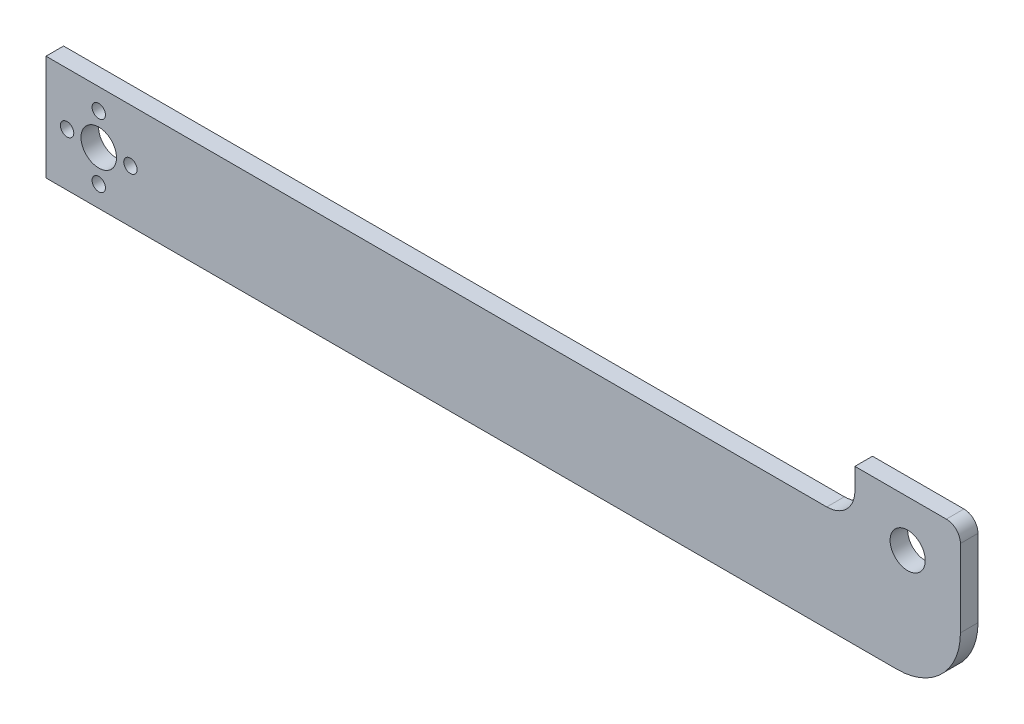
ISO-10303-21;
HEADER;
FILE_DESCRIPTION(('STEP AP214'),'2;1');
FILE_NAME('part.step','',(''),(''),'','','');
FILE_SCHEMA(('AUTOMOTIVE_DESIGN { 1 0 10303 214 1 1 1 1 }'));
ENDSEC;
DATA;
#1=APPLICATION_CONTEXT('core data for automotive mechanical design processes');
#2=APPLICATION_PROTOCOL_DEFINITION('international standard','automotive_design',2000,#1);
#3=PRODUCT_CONTEXT('',#1,'mechanical');
#4=PRODUCT('Part','Part','',(#3));
#5=PRODUCT_RELATED_PRODUCT_CATEGORY('part','',(#4));
#6=PRODUCT_DEFINITION_FORMATION('','',#4);
#7=PRODUCT_DEFINITION_CONTEXT('part definition',#1,'design');
#8=PRODUCT_DEFINITION('design','',#6,#7);
#9=PRODUCT_DEFINITION_SHAPE('','',#8);
#10=(LENGTH_UNIT() NAMED_UNIT(*) SI_UNIT(.MILLI.,.METRE.));
#11=(NAMED_UNIT(*) PLANE_ANGLE_UNIT() SI_UNIT($,.RADIAN.));
#12=(NAMED_UNIT(*) SI_UNIT($,.STERADIAN.) SOLID_ANGLE_UNIT());
#13=UNCERTAINTY_MEASURE_WITH_UNIT(LENGTH_MEASURE(1.E-05),#10,'distance_accuracy_value','');
#14=(GEOMETRIC_REPRESENTATION_CONTEXT(3) GLOBAL_UNCERTAINTY_ASSIGNED_CONTEXT((#13)) GLOBAL_UNIT_ASSIGNED_CONTEXT((#10,
#11,#12)) REPRESENTATION_CONTEXT('',''));
#15=CARTESIAN_POINT('',(0.,0.,0.));
#16=DIRECTION('',(0.,0.,1.));
#17=DIRECTION('',(1.,0.,0.));
#18=AXIS2_PLACEMENT_3D('',#15,#16,#17);
#19=CARTESIAN_POINT('',(288.29,3.81,6.35));
#20=DIRECTION('',(0.,0.,1.));
#21=DIRECTION('',(1.,0.,0.));
#22=AXIS2_PLACEMENT_3D('',#19,#20,#21);
#23=PLANE('',#22);
#24=CARTESIAN_POINT('',(-11.4299999999997,-3.24160253143805E-13,6.35));
#25=DIRECTION('',(0.,0.,1.));
#26=DIRECTION('',(1.,0.,0.));
#27=AXIS2_PLACEMENT_3D('',#24,#25,#26);
#28=CIRCLE('',#27,2.413);
#29=CARTESIAN_POINT('',(-9.01699999999968,-3.24160253143805E-13,6.35));
#30=VERTEX_POINT('',#29);
#31=EDGE_CURVE('E197',#30,#30,#28,.T.);
#32=ORIENTED_EDGE('',*,*,#31,.F.);
#33=EDGE_LOOP('',(#32));
#34=FACE_BOUND('',#33,.T.);
#35=CARTESIAN_POINT('',(11.4300000000003,3.2276048185238E-13,6.35));
#36=DIRECTION('',(0.,0.,1.));
#37=DIRECTION('',(1.,0.,0.));
#38=AXIS2_PLACEMENT_3D('',#35,#36,#37);
#39=CIRCLE('',#38,2.413);
#40=CARTESIAN_POINT('',(13.8430000000003,3.2276048185238E-13,6.35));
#41=VERTEX_POINT('',#40);
#42=EDGE_CURVE('E185',#41,#41,#39,.T.);
#43=ORIENTED_EDGE('',*,*,#42,.F.);
#44=EDGE_LOOP('',(#43));
#45=FACE_BOUND('',#44,.T.);
#46=CARTESIAN_POINT('',(0.,0.,6.35));
#47=DIRECTION('',(0.,0.,1.));
#48=DIRECTION('',(1.,0.,0.));
#49=AXIS2_PLACEMENT_3D('',#46,#47,#48);
#50=CIRCLE('',#49,6.4135);
#51=CARTESIAN_POINT('',(6.4135,0.,6.35));
#52=VERTEX_POINT('',#51);
#53=EDGE_CURVE('E165',#52,#52,#50,.T.);
#54=ORIENTED_EDGE('',*,*,#53,.F.);
#55=EDGE_LOOP('',(#54));
#56=FACE_BOUND('',#55,.T.);
#57=DIRECTION('',(0.,1.,0.));
#58=VECTOR('',#57,1.);
#59=CARTESIAN_POINT('',(311.15,3.81,6.35));
#60=LINE('',#59,#58);
#61=CARTESIAN_POINT('',(311.15,3.81,6.35));
#62=VERTEX_POINT('',#61);
#63=CARTESIAN_POINT('',(311.15,31.75,6.35));
#64=VERTEX_POINT('',#63);
#65=EDGE_CURVE('E173',#62,#64,#60,.T.);
#66=ORIENTED_EDGE('',*,*,#65,.T.);
#67=CARTESIAN_POINT('',(306.07,31.75,6.35));
#68=DIRECTION('',(0.,0.,1.));
#69=DIRECTION('',(1.,0.,0.));
#70=AXIS2_PLACEMENT_3D('',#67,#68,#69);
#71=CIRCLE('',#70,5.08);
#72=CARTESIAN_POINT('',(306.07,36.83,6.35));
#73=VERTEX_POINT('',#72);
#74=EDGE_CURVE('E11',#64,#73,#71,.T.);
#75=ORIENTED_EDGE('',*,*,#74,.T.);
#76=DIRECTION('',(-1.,0.,0.));
#77=VECTOR('',#76,1.);
#78=CARTESIAN_POINT('',(273.05,36.83,6.35));
#79=LINE('',#78,#77);
#80=CARTESIAN_POINT('',(273.05,36.83,6.35));
#81=VERTEX_POINT('',#80);
#82=EDGE_CURVE('E171',#73,#81,#79,.T.);
#83=ORIENTED_EDGE('',*,*,#82,.T.);
#84=DIRECTION('',(0.,-1.,0.));
#85=VECTOR('',#84,1.);
#86=CARTESIAN_POINT('',(273.05,36.83,6.35));
#87=LINE('',#86,#85);
#88=CARTESIAN_POINT('',(273.05,29.21,6.35));
#89=VERTEX_POINT('',#88);
#90=EDGE_CURVE('E169',#81,#89,#87,.T.);
#91=ORIENTED_EDGE('',*,*,#90,.T.);
#92=CARTESIAN_POINT('',(262.89,29.21,6.35));
#93=DIRECTION('',(0.,0.,-1.));
#94=DIRECTION('',(-1.,0.,0.));
#95=AXIS2_PLACEMENT_3D('',#92,#93,#94);
#96=CIRCLE('',#95,10.16);
#97=CARTESIAN_POINT('',(262.89,19.05,6.35));
#98=VERTEX_POINT('',#97);
#99=EDGE_CURVE('E167',#89,#98,#96,.T.);
#100=ORIENTED_EDGE('',*,*,#99,.T.);
#101=DIRECTION('',(-1.,0.,0.));
#102=VECTOR('',#101,1.);
#103=CARTESIAN_POINT('',(-19.05,19.05,6.35));
#104=LINE('',#103,#102);
#105=CARTESIAN_POINT('',(-19.05,19.05,6.35));
#106=VERTEX_POINT('',#105);
#107=EDGE_CURVE('E121',#98,#106,#104,.T.);
#108=ORIENTED_EDGE('',*,*,#107,.T.);
#109=DIRECTION('',(0.,-1.,0.));
#110=VECTOR('',#109,1.);
#111=CARTESIAN_POINT('',(-19.05,19.05,6.35));
#112=LINE('',#111,#110);
#113=CARTESIAN_POINT('',(-19.05,-19.05,6.35));
#114=VERTEX_POINT('',#113);
#115=EDGE_CURVE('E116',#106,#114,#112,.T.);
#116=ORIENTED_EDGE('',*,*,#115,.T.);
#117=DIRECTION('',(1.,0.,0.));
#118=VECTOR('',#117,1.);
#119=CARTESIAN_POINT('',(-19.05,-19.05,6.35));
#120=LINE('',#119,#118);
#121=CARTESIAN_POINT('',(288.29,-19.05,6.35));
#122=VERTEX_POINT('',#121);
#123=EDGE_CURVE('E105',#114,#122,#120,.T.);
#124=ORIENTED_EDGE('',*,*,#123,.T.);
#125=CARTESIAN_POINT('',(288.29,3.81,6.35));
#126=DIRECTION('',(0.,0.,1.));
#127=DIRECTION('',(1.,0.,0.));
#128=AXIS2_PLACEMENT_3D('',#125,#126,#127);
#129=CIRCLE('',#128,22.86);
#130=EDGE_CURVE('E115',#122,#62,#129,.T.);
#131=ORIENTED_EDGE('',*,*,#130,.T.);
#132=EDGE_LOOP('',(#66,#75,#83,#91,#100,#108,#116,#124,#131));
#133=FACE_BOUND('',#132,.T.);
#134=CARTESIAN_POINT('',(0.,11.43,6.35));
#135=DIRECTION('',(0.,0.,1.));
#136=DIRECTION('',(1.,0.,0.));
#137=AXIS2_PLACEMENT_3D('',#134,#135,#136);
#138=CIRCLE('',#137,2.413);
#139=CARTESIAN_POINT('',(2.413,11.43,6.35));
#140=VERTEX_POINT('',#139);
#141=EDGE_CURVE('E179',#140,#140,#138,.T.);
#142=ORIENTED_EDGE('',*,*,#141,.F.);
#143=EDGE_LOOP('',(#142));
#144=FACE_BOUND('',#143,.T.);
#145=CARTESIAN_POINT('',(6.45520963704759E-13,-11.43,6.35));
#146=DIRECTION('',(0.,0.,1.));
#147=DIRECTION('',(1.,0.,0.));
#148=AXIS2_PLACEMENT_3D('',#145,#146,#147);
#149=CIRCLE('',#148,2.413);
#150=CARTESIAN_POINT('',(2.41300000000065,-11.43,6.35));
#151=VERTEX_POINT('',#150);
#152=EDGE_CURVE('E191',#151,#151,#149,.T.);
#153=ORIENTED_EDGE('',*,*,#152,.F.);
#154=EDGE_LOOP('',(#153));
#155=FACE_BOUND('',#154,.T.);
#156=CARTESIAN_POINT('',(292.1,20.066,6.35));
#157=DIRECTION('',(0.,0.,1.));
#158=DIRECTION('',(1.,0.,0.));
#159=AXIS2_PLACEMENT_3D('',#156,#157,#158);
#160=CIRCLE('',#159,6.35);
#161=CARTESIAN_POINT('',(298.45,20.066,6.35));
#162=VERTEX_POINT('',#161);
#163=EDGE_CURVE('E203',#162,#162,#160,.T.);
#164=ORIENTED_EDGE('',*,*,#163,.F.);
#165=EDGE_LOOP('',(#164));
#166=FACE_BOUND('',#165,.T.);
#167=ADVANCED_FACE('F34',(#34,#45,#56,#133,#144,#155,#166),#23,.T.);
#168=CARTESIAN_POINT('',(288.29,3.81,0.));
#169=DIRECTION('',(0.,0.,1.));
#170=DIRECTION('',(1.,0.,0.));
#171=AXIS2_PLACEMENT_3D('',#168,#169,#170);
#172=PLANE('',#171);
#173=DIRECTION('',(-1.,0.,0.));
#174=VECTOR('',#173,1.);
#175=CARTESIAN_POINT('',(273.05,36.83,0.));
#176=LINE('',#175,#174);
#177=CARTESIAN_POINT('',(306.07,36.83,0.));
#178=VERTEX_POINT('',#177);
#179=CARTESIAN_POINT('',(273.05,36.83,0.));
#180=VERTEX_POINT('',#179);
#181=EDGE_CURVE('E156',#178,#180,#176,.T.);
#182=ORIENTED_EDGE('',*,*,#181,.F.);
#183=CARTESIAN_POINT('',(306.07,31.75,0.));
#184=DIRECTION('',(0.,0.,1.));
#185=DIRECTION('',(1.,0.,0.));
#186=AXIS2_PLACEMENT_3D('',#183,#184,#185);
#187=CIRCLE('',#186,5.08);
#188=CARTESIAN_POINT('',(311.15,31.75,0.));
#189=VERTEX_POINT('',#188);
#190=EDGE_CURVE('E56',#178,#189,#187,.F.);
#191=ORIENTED_EDGE('',*,*,#190,.T.);
#192=DIRECTION('',(0.,1.,0.));
#193=VECTOR('',#192,1.);
#194=CARTESIAN_POINT('',(311.15,3.81,0.));
#195=LINE('',#194,#193);
#196=CARTESIAN_POINT('',(311.15,3.81,0.));
#197=VERTEX_POINT('',#196);
#198=EDGE_CURVE('E158',#197,#189,#195,.T.);
#199=ORIENTED_EDGE('',*,*,#198,.F.);
#200=CARTESIAN_POINT('',(288.29,3.81,0.));
#201=DIRECTION('',(0.,0.,1.));
#202=DIRECTION('',(1.,0.,0.));
#203=AXIS2_PLACEMENT_3D('',#200,#201,#202);
#204=CIRCLE('',#203,22.86);
#205=CARTESIAN_POINT('',(288.29,-19.05,0.));
#206=VERTEX_POINT('',#205);
#207=EDGE_CURVE('E160',#206,#197,#204,.T.);
#208=ORIENTED_EDGE('',*,*,#207,.F.);
#209=DIRECTION('',(1.,0.,0.));
#210=VECTOR('',#209,1.);
#211=CARTESIAN_POINT('',(285.190051277331,-19.05,0.));
#212=LINE('',#211,#210);
#213=CARTESIAN_POINT('',(-19.05,-19.05,0.));
#214=VERTEX_POINT('',#213);
#215=EDGE_CURVE('E162',#214,#206,#212,.T.);
#216=ORIENTED_EDGE('',*,*,#215,.F.);
#217=DIRECTION('',(0.,-1.,0.));
#218=VECTOR('',#217,1.);
#219=CARTESIAN_POINT('',(-19.05,19.05,0.));
#220=LINE('',#219,#218);
#221=CARTESIAN_POINT('',(-19.05,19.05,0.));
#222=VERTEX_POINT('',#221);
#223=EDGE_CURVE('E129',#222,#214,#220,.T.);
#224=ORIENTED_EDGE('',*,*,#223,.F.);
#225=DIRECTION('',(-1.,0.,0.));
#226=VECTOR('',#225,1.);
#227=CARTESIAN_POINT('',(-19.05,19.05,0.));
#228=LINE('',#227,#226);
#229=CARTESIAN_POINT('',(262.89,19.05,0.));
#230=VERTEX_POINT('',#229);
#231=EDGE_CURVE('E125',#230,#222,#228,.T.);
#232=ORIENTED_EDGE('',*,*,#231,.F.);
#233=CARTESIAN_POINT('',(262.89,29.21,0.));
#234=DIRECTION('',(0.,0.,-1.));
#235=DIRECTION('',(-1.,0.,0.));
#236=AXIS2_PLACEMENT_3D('',#233,#234,#235);
#237=CIRCLE('',#236,10.16);
#238=CARTESIAN_POINT('',(273.05,29.21,0.));
#239=VERTEX_POINT('',#238);
#240=EDGE_CURVE('E152',#239,#230,#237,.T.);
#241=ORIENTED_EDGE('',*,*,#240,.F.);
#242=DIRECTION('',(0.,-1.,0.));
#243=VECTOR('',#242,1.);
#244=CARTESIAN_POINT('',(273.05,36.83,0.));
#245=LINE('',#244,#243);
#246=EDGE_CURVE('E154',#180,#239,#245,.T.);
#247=ORIENTED_EDGE('',*,*,#246,.F.);
#248=EDGE_LOOP('',(#182,#191,#199,#208,#216,#224,#232,#241,#247));
#249=FACE_BOUND('',#248,.T.);
#250=CARTESIAN_POINT('',(0.,0.,0.));
#251=DIRECTION('',(0.,0.,1.));
#252=DIRECTION('',(1.,0.,0.));
#253=AXIS2_PLACEMENT_3D('',#250,#251,#252);
#254=CIRCLE('',#253,6.4135);
#255=CARTESIAN_POINT('',(6.4135,0.,0.));
#256=VERTEX_POINT('',#255);
#257=EDGE_CURVE('E176',#256,#256,#254,.T.);
#258=ORIENTED_EDGE('',*,*,#257,.T.);
#259=EDGE_LOOP('',(#258));
#260=FACE_BOUND('',#259,.T.);
#261=CARTESIAN_POINT('',(0.,11.43,0.));
#262=DIRECTION('',(0.,0.,1.));
#263=DIRECTION('',(1.,0.,0.));
#264=AXIS2_PLACEMENT_3D('',#261,#262,#263);
#265=CIRCLE('',#264,2.413);
#266=CARTESIAN_POINT('',(2.413,11.43,0.));
#267=VERTEX_POINT('',#266);
#268=EDGE_CURVE('E182',#267,#267,#265,.T.);
#269=ORIENTED_EDGE('',*,*,#268,.T.);
#270=EDGE_LOOP('',(#269));
#271=FACE_BOUND('',#270,.T.);
#272=CARTESIAN_POINT('',(11.4300000000003,3.2276048185238E-13,0.));
#273=DIRECTION('',(0.,0.,1.));
#274=DIRECTION('',(1.,0.,0.));
#275=AXIS2_PLACEMENT_3D('',#272,#273,#274);
#276=CIRCLE('',#275,2.413);
#277=CARTESIAN_POINT('',(13.8430000000003,3.2276048185238E-13,0.));
#278=VERTEX_POINT('',#277);
#279=EDGE_CURVE('E188',#278,#278,#276,.T.);
#280=ORIENTED_EDGE('',*,*,#279,.T.);
#281=EDGE_LOOP('',(#280));
#282=FACE_BOUND('',#281,.T.);
#283=CARTESIAN_POINT('',(6.45520963704759E-13,-11.43,0.));
#284=DIRECTION('',(0.,0.,1.));
#285=DIRECTION('',(1.,0.,0.));
#286=AXIS2_PLACEMENT_3D('',#283,#284,#285);
#287=CIRCLE('',#286,2.413);
#288=CARTESIAN_POINT('',(2.41300000000065,-11.43,0.));
#289=VERTEX_POINT('',#288);
#290=EDGE_CURVE('E194',#289,#289,#287,.T.);
#291=ORIENTED_EDGE('',*,*,#290,.T.);
#292=EDGE_LOOP('',(#291));
#293=FACE_BOUND('',#292,.T.);
#294=CARTESIAN_POINT('',(-11.4299999999997,-3.24160253143805E-13,0.));
#295=DIRECTION('',(0.,0.,1.));
#296=DIRECTION('',(1.,0.,0.));
#297=AXIS2_PLACEMENT_3D('',#294,#295,#296);
#298=CIRCLE('',#297,2.413);
#299=CARTESIAN_POINT('',(-9.01699999999968,-3.24160253143805E-13,0.));
#300=VERTEX_POINT('',#299);
#301=EDGE_CURVE('E200',#300,#300,#298,.T.);
#302=ORIENTED_EDGE('',*,*,#301,.T.);
#303=EDGE_LOOP('',(#302));
#304=FACE_BOUND('',#303,.T.);
#305=CARTESIAN_POINT('',(292.1,20.066,0.));
#306=DIRECTION('',(0.,0.,1.));
#307=DIRECTION('',(1.,0.,0.));
#308=AXIS2_PLACEMENT_3D('',#305,#306,#307);
#309=CIRCLE('',#308,6.35);
#310=CARTESIAN_POINT('',(298.45,20.066,0.));
#311=VERTEX_POINT('',#310);
#312=EDGE_CURVE('E206',#311,#311,#309,.T.);
#313=ORIENTED_EDGE('',*,*,#312,.T.);
#314=EDGE_LOOP('',(#313));
#315=FACE_BOUND('',#314,.T.);
#316=ADVANCED_FACE('F216',(#249,#260,#271,#282,#293,#304,#315),#172,.F.);
#317=CARTESIAN_POINT('',(-19.05,19.05,6.35));
#318=DIRECTION('',(1.,0.,0.));
#319=DIRECTION('',(0.,0.,-1.));
#320=AXIS2_PLACEMENT_3D('',#317,#318,#319);
#321=PLANE('',#320);
#322=ORIENTED_EDGE('',*,*,#223,.T.);
#323=DIRECTION('',(0.,0.,-1.));
#324=VECTOR('',#323,1.);
#325=CARTESIAN_POINT('',(-19.05,-19.05,6.35));
#326=LINE('',#325,#324);
#327=EDGE_CURVE('E109',#114,#214,#326,.T.);
#328=ORIENTED_EDGE('',*,*,#327,.F.);
#329=ORIENTED_EDGE('',*,*,#115,.F.);
#330=DIRECTION('',(0.,0.,-1.));
#331=VECTOR('',#330,1.);
#332=CARTESIAN_POINT('',(-19.05,19.05,6.35));
#333=LINE('',#332,#331);
#334=EDGE_CURVE('E149',#106,#222,#333,.T.);
#335=ORIENTED_EDGE('',*,*,#334,.T.);
#336=EDGE_LOOP('',(#322,#328,#329,#335));
#337=FACE_BOUND('',#336,.T.);
#338=ADVANCED_FACE('F127',(#337),#321,.F.);
#339=CARTESIAN_POINT('',(285.190051277331,-19.05,6.35));
#340=DIRECTION('',(0.,1.,0.));
#341=DIRECTION('',(0.,0.,1.));
#342=AXIS2_PLACEMENT_3D('',#339,#340,#341);
#343=PLANE('',#342);
#344=ORIENTED_EDGE('',*,*,#215,.T.);
#345=DIRECTION('',(0.,0.,-1.));
#346=VECTOR('',#345,1.);
#347=CARTESIAN_POINT('',(288.29,-19.05,6.35));
#348=LINE('',#347,#346);
#349=EDGE_CURVE('E112',#122,#206,#348,.T.);
#350=ORIENTED_EDGE('',*,*,#349,.F.);
#351=ORIENTED_EDGE('',*,*,#123,.F.);
#352=ORIENTED_EDGE('',*,*,#327,.T.);
#353=EDGE_LOOP('',(#344,#350,#351,#352));
#354=FACE_BOUND('',#353,.T.);
#355=ADVANCED_FACE('F107',(#354),#343,.F.);
#356=CARTESIAN_POINT('',(288.29,3.81,6.35));
#357=DIRECTION('',(0.,0.,-1.));
#358=DIRECTION('',(-1.,0.,0.));
#359=AXIS2_PLACEMENT_3D('',#356,#357,#358);
#360=CYLINDRICAL_SURFACE('',#359,22.86);
#361=ORIENTED_EDGE('',*,*,#207,.T.);
#362=DIRECTION('',(0.,0.,-1.));
#363=VECTOR('',#362,1.);
#364=CARTESIAN_POINT('',(311.15,3.81,6.35));
#365=LINE('',#364,#363);
#366=EDGE_CURVE('E134',#62,#197,#365,.T.);
#367=ORIENTED_EDGE('',*,*,#366,.F.);
#368=ORIENTED_EDGE('',*,*,#130,.F.);
#369=ORIENTED_EDGE('',*,*,#349,.T.);
#370=EDGE_LOOP('',(#361,#367,#368,#369));
#371=FACE_BOUND('',#370,.T.);
#372=ADVANCED_FACE('F248',(#371),#360,.T.);
#373=CARTESIAN_POINT('',(311.15,3.81,6.35));
#374=DIRECTION('',(-1.,0.,0.));
#375=DIRECTION('',(0.,-1.,0.));
#376=AXIS2_PLACEMENT_3D('',#373,#374,#375);
#377=PLANE('',#376);
#378=ORIENTED_EDGE('',*,*,#198,.T.);
#379=DIRECTION('',(0.,0.,-1.));
#380=VECTOR('',#379,1.);
#381=CARTESIAN_POINT('',(311.15,31.75,6.35));
#382=LINE('',#381,#380);
#383=EDGE_CURVE('E42',#189,#64,#382,.F.);
#384=ORIENTED_EDGE('',*,*,#383,.T.);
#385=ORIENTED_EDGE('',*,*,#65,.F.);
#386=ORIENTED_EDGE('',*,*,#366,.T.);
#387=EDGE_LOOP('',(#378,#384,#385,#386));
#388=FACE_BOUND('',#387,.T.);
#389=ADVANCED_FACE('F244',(#388),#377,.F.);
#390=CARTESIAN_POINT('',(273.05,36.83,6.35));
#391=DIRECTION('',(0.,-1.,0.));
#392=DIRECTION('',(0.,0.,-1.));
#393=AXIS2_PLACEMENT_3D('',#390,#391,#392);
#394=PLANE('',#393);
#395=ORIENTED_EDGE('',*,*,#82,.F.);
#396=DIRECTION('',(0.,0.,-1.));
#397=VECTOR('',#396,1.);
#398=CARTESIAN_POINT('',(306.07,36.83,6.35));
#399=LINE('',#398,#397);
#400=EDGE_CURVE('E130',#73,#178,#399,.T.);
#401=ORIENTED_EDGE('',*,*,#400,.T.);
#402=ORIENTED_EDGE('',*,*,#181,.T.);
#403=DIRECTION('',(0.,0.,-1.));
#404=VECTOR('',#403,1.);
#405=CARTESIAN_POINT('',(273.05,36.83,6.35));
#406=LINE('',#405,#404);
#407=EDGE_CURVE('E140',#81,#180,#406,.T.);
#408=ORIENTED_EDGE('',*,*,#407,.F.);
#409=EDGE_LOOP('',(#395,#401,#402,#408));
#410=FACE_BOUND('',#409,.T.);
#411=ADVANCED_FACE('F240',(#410),#394,.F.);
#412=CARTESIAN_POINT('',(273.05,36.83,6.35));
#413=DIRECTION('',(1.,0.,0.));
#414=DIRECTION('',(0.,1.,0.));
#415=AXIS2_PLACEMENT_3D('',#412,#413,#414);
#416=PLANE('',#415);
#417=ORIENTED_EDGE('',*,*,#246,.T.);
#418=DIRECTION('',(0.,0.,-1.));
#419=VECTOR('',#418,1.);
#420=CARTESIAN_POINT('',(273.05,29.21,6.35));
#421=LINE('',#420,#419);
#422=EDGE_CURVE('E143',#89,#239,#421,.T.);
#423=ORIENTED_EDGE('',*,*,#422,.F.);
#424=ORIENTED_EDGE('',*,*,#90,.F.);
#425=ORIENTED_EDGE('',*,*,#407,.T.);
#426=EDGE_LOOP('',(#417,#423,#424,#425));
#427=FACE_BOUND('',#426,.T.);
#428=ADVANCED_FACE('F236',(#427),#416,.F.);
#429=CARTESIAN_POINT('',(262.89,29.21,6.35));
#430=DIRECTION('',(0.,0.,-1.));
#431=DIRECTION('',(-1.,0.,0.));
#432=AXIS2_PLACEMENT_3D('',#429,#430,#431);
#433=CYLINDRICAL_SURFACE('',#432,10.16);
#434=ORIENTED_EDGE('',*,*,#240,.T.);
#435=DIRECTION('',(0.,0.,-1.));
#436=VECTOR('',#435,1.);
#437=CARTESIAN_POINT('',(262.89,19.05,6.35));
#438=LINE('',#437,#436);
#439=EDGE_CURVE('E146',#98,#230,#438,.T.);
#440=ORIENTED_EDGE('',*,*,#439,.F.);
#441=ORIENTED_EDGE('',*,*,#99,.F.);
#442=ORIENTED_EDGE('',*,*,#422,.T.);
#443=EDGE_LOOP('',(#434,#440,#441,#442));
#444=FACE_BOUND('',#443,.T.);
#445=ADVANCED_FACE('F232',(#444),#433,.F.);
#446=CARTESIAN_POINT('',(-19.05,19.05,6.35));
#447=DIRECTION('',(0.,-1.,0.));
#448=DIRECTION('',(1.,0.,0.));
#449=AXIS2_PLACEMENT_3D('',#446,#447,#448);
#450=PLANE('',#449);
#451=ORIENTED_EDGE('',*,*,#231,.T.);
#452=ORIENTED_EDGE('',*,*,#334,.F.);
#453=ORIENTED_EDGE('',*,*,#107,.F.);
#454=ORIENTED_EDGE('',*,*,#439,.T.);
#455=EDGE_LOOP('',(#451,#452,#453,#454));
#456=FACE_BOUND('',#455,.T.);
#457=ADVANCED_FACE('F229',(#456),#450,.F.);
#458=CARTESIAN_POINT('',(0.,0.,6.35));
#459=DIRECTION('',(0.,0.,-1.));
#460=DIRECTION('',(-1.,0.,0.));
#461=AXIS2_PLACEMENT_3D('',#458,#459,#460);
#462=CYLINDRICAL_SURFACE('',#461,6.4135);
#463=ORIENTED_EDGE('',*,*,#53,.T.);
#464=EDGE_LOOP('',(#463));
#465=FACE_BOUND('',#464,.T.);
#466=ORIENTED_EDGE('',*,*,#257,.F.);
#467=EDGE_LOOP('',(#466));
#468=FACE_BOUND('',#467,.T.);
#469=ADVANCED_FACE('F226',(#465,#468),#462,.F.);
#470=CARTESIAN_POINT('',(0.,11.43,6.35));
#471=DIRECTION('',(0.,0.,-1.));
#472=DIRECTION('',(-1.,0.,0.));
#473=AXIS2_PLACEMENT_3D('',#470,#471,#472);
#474=CYLINDRICAL_SURFACE('',#473,2.413);
#475=ORIENTED_EDGE('',*,*,#141,.T.);
#476=EDGE_LOOP('',(#475));
#477=FACE_BOUND('',#476,.T.);
#478=ORIENTED_EDGE('',*,*,#268,.F.);
#479=EDGE_LOOP('',(#478));
#480=FACE_BOUND('',#479,.T.);
#481=ADVANCED_FACE('F293',(#477,#480),#474,.F.);
#482=CARTESIAN_POINT('',(11.4300000000003,3.2276048185238E-13,6.35));
#483=DIRECTION('',(0.,0.,-1.));
#484=DIRECTION('',(-1.,0.,0.));
#485=AXIS2_PLACEMENT_3D('',#482,#483,#484);
#486=CYLINDRICAL_SURFACE('',#485,2.413);
#487=ORIENTED_EDGE('',*,*,#42,.T.);
#488=EDGE_LOOP('',(#487));
#489=FACE_BOUND('',#488,.T.);
#490=ORIENTED_EDGE('',*,*,#279,.F.);
#491=EDGE_LOOP('',(#490));
#492=FACE_BOUND('',#491,.T.);
#493=ADVANCED_FACE('F300',(#489,#492),#486,.F.);
#494=CARTESIAN_POINT('',(6.45520963704759E-13,-11.43,6.35));
#495=DIRECTION('',(0.,0.,-1.));
#496=DIRECTION('',(-1.,0.,0.));
#497=AXIS2_PLACEMENT_3D('',#494,#495,#496);
#498=CYLINDRICAL_SURFACE('',#497,2.413);
#499=ORIENTED_EDGE('',*,*,#152,.T.);
#500=EDGE_LOOP('',(#499));
#501=FACE_BOUND('',#500,.T.);
#502=ORIENTED_EDGE('',*,*,#290,.F.);
#503=EDGE_LOOP('',(#502));
#504=FACE_BOUND('',#503,.T.);
#505=ADVANCED_FACE('F307',(#501,#504),#498,.F.);
#506=CARTESIAN_POINT('',(-11.4299999999997,-3.24160253143805E-13,6.35));
#507=DIRECTION('',(0.,0.,-1.));
#508=DIRECTION('',(-1.,0.,0.));
#509=AXIS2_PLACEMENT_3D('',#506,#507,#508);
#510=CYLINDRICAL_SURFACE('',#509,2.413);
#511=ORIENTED_EDGE('',*,*,#31,.T.);
#512=EDGE_LOOP('',(#511));
#513=FACE_BOUND('',#512,.T.);
#514=ORIENTED_EDGE('',*,*,#301,.F.);
#515=EDGE_LOOP('',(#514));
#516=FACE_BOUND('',#515,.T.);
#517=ADVANCED_FACE('F315',(#513,#516),#510,.F.);
#518=CARTESIAN_POINT('',(292.1,20.066,6.35));
#519=DIRECTION('',(0.,0.,-1.));
#520=DIRECTION('',(-1.,0.,0.));
#521=AXIS2_PLACEMENT_3D('',#518,#519,#520);
#522=CYLINDRICAL_SURFACE('',#521,6.35);
#523=ORIENTED_EDGE('',*,*,#163,.T.);
#524=EDGE_LOOP('',(#523));
#525=FACE_BOUND('',#524,.T.);
#526=ORIENTED_EDGE('',*,*,#312,.F.);
#527=EDGE_LOOP('',(#526));
#528=FACE_BOUND('',#527,.T.);
#529=ADVANCED_FACE('F212',(#525,#528),#522,.F.);
#530=CARTESIAN_POINT('',(306.07,31.75,6.35));
#531=DIRECTION('',(0.,0.,-1.));
#532=DIRECTION('',(-1.,0.,0.));
#533=AXIS2_PLACEMENT_3D('',#530,#531,#532);
#534=CYLINDRICAL_SURFACE('',#533,5.08);
#535=ORIENTED_EDGE('',*,*,#74,.F.);
#536=ORIENTED_EDGE('',*,*,#383,.F.);
#537=ORIENTED_EDGE('',*,*,#190,.F.);
#538=ORIENTED_EDGE('',*,*,#400,.F.);
#539=EDGE_LOOP('',(#535,#536,#537,#538));
#540=FACE_BOUND('',#539,.T.);
#541=ADVANCED_FACE('F36',(#540),#534,.T.);
#542=CLOSED_SHELL('',(#167,#316,#338,#355,#372,#389,#411,#428,#445,#457,#469,#481,#493,#505,
#517,#529,#541));
#543=MANIFOLD_SOLID_BREP('B2',#542);
#544=ADVANCED_BREP_SHAPE_REPRESENTATION('',(#18,#543),#14);
#545=SHAPE_DEFINITION_REPRESENTATION(#9,#544);
ENDSEC;
END-ISO-10303-21;
